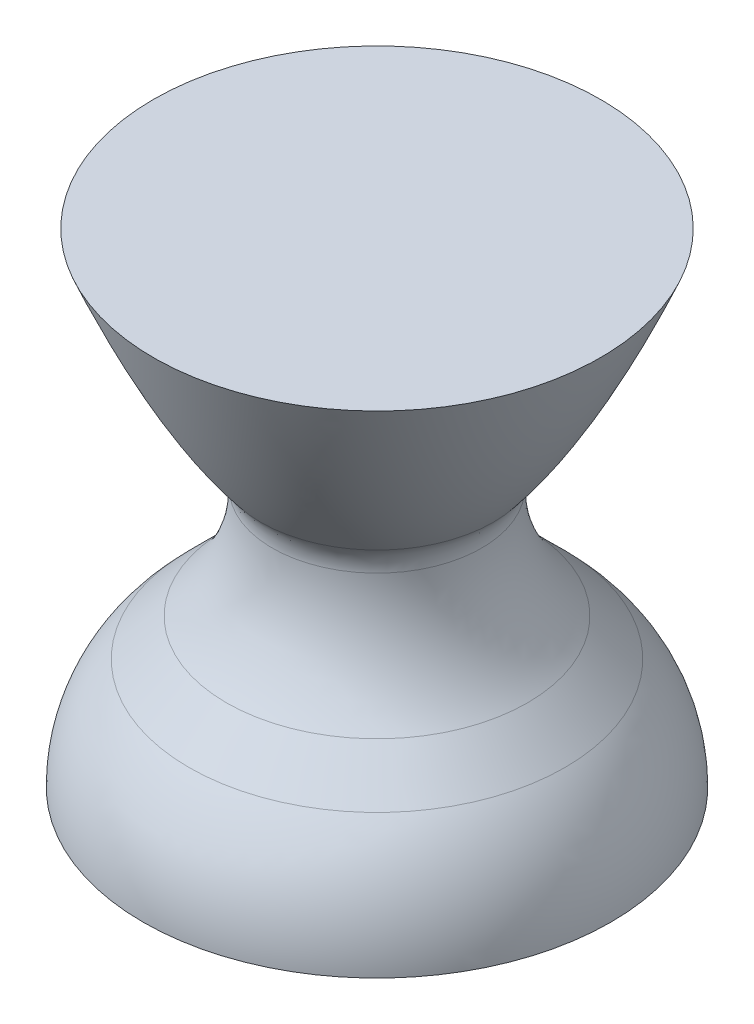
ISO-10303-21;
HEADER;
FILE_DESCRIPTION(('STEP AP214'),'2;1');
FILE_NAME('part.step','',(''),(''),'','','');
FILE_SCHEMA(('AUTOMOTIVE_DESIGN { 1 0 10303 214 1 1 1 1 }'));
ENDSEC;
DATA;
#1=APPLICATION_CONTEXT('core data for automotive mechanical design processes');
#2=APPLICATION_PROTOCOL_DEFINITION('international standard','automotive_design',2000,#1);
#3=PRODUCT_CONTEXT('',#1,'mechanical');
#4=PRODUCT('Part','Part','',(#3));
#5=PRODUCT_RELATED_PRODUCT_CATEGORY('part','',(#4));
#6=PRODUCT_DEFINITION_FORMATION('','',#4);
#7=PRODUCT_DEFINITION_CONTEXT('part definition',#1,'design');
#8=PRODUCT_DEFINITION('design','',#6,#7);
#9=PRODUCT_DEFINITION_SHAPE('','',#8);
#10=(LENGTH_UNIT() NAMED_UNIT(*) SI_UNIT(.MILLI.,.METRE.));
#11=(NAMED_UNIT(*) PLANE_ANGLE_UNIT() SI_UNIT($,.RADIAN.));
#12=(NAMED_UNIT(*) SI_UNIT($,.STERADIAN.) SOLID_ANGLE_UNIT());
#13=UNCERTAINTY_MEASURE_WITH_UNIT(LENGTH_MEASURE(1.E-05),#10,'distance_accuracy_value','');
#14=(GEOMETRIC_REPRESENTATION_CONTEXT(3) GLOBAL_UNCERTAINTY_ASSIGNED_CONTEXT((#13)) GLOBAL_UNIT_ASSIGNED_CONTEXT((#10,
#11,#12)) REPRESENTATION_CONTEXT('',''));
#15=CARTESIAN_POINT('',(0.,0.,0.));
#16=DIRECTION('',(0.,0.,1.));
#17=DIRECTION('',(1.,0.,0.));
#18=AXIS2_PLACEMENT_3D('',#15,#16,#17);
#19=CARTESIAN_POINT('',(24.0991884712947,0.000275515382464213,0.));
#20=CARTESIAN_POINT('',(24.0991890977388,0.0361681675618741,0.));
#21=CARTESIAN_POINT('',(24.0997269286903,0.110389204905756,0.));
#22=CARTESIAN_POINT('',(24.1021443200164,0.267916584778156,0.));
#23=CARTESIAN_POINT('',(24.1085821651237,0.427339632492085,0.));
#24=CARTESIAN_POINT('',(24.1206541960184,0.647039781668012,0.));
#25=CARTESIAN_POINT('',(24.1415556843351,0.901708843238853,0.));
#26=CARTESIAN_POINT('',(24.1753053160884,1.2028127882671,0.));
#27=CARTESIAN_POINT('',(24.2266199026096,1.5423260132071,0.));
#28=CARTESIAN_POINT('',(24.2906642986896,1.8812722923424,0.));
#29=CARTESIAN_POINT('',(24.3672621985688,2.21662993537458,0.));
#30=CARTESIAN_POINT('',(24.4564441685258,2.54951493609417,0.));
#31=CARTESIAN_POINT('',(24.5578620103598,2.87836816012632,0.));
#32=CARTESIAN_POINT('',(24.6717396678001,3.20362255639874,0.));
#33=CARTESIAN_POINT('',(24.7973173684178,3.5239026725951,0.));
#34=CARTESIAN_POINT('',(24.9354065740553,3.83994224812192,0.));
#35=CARTESIAN_POINT('',(25.0841908977971,4.14955769973447,0.));
#36=CARTESIAN_POINT('',(25.2461328197384,4.45505863815677,0.));
#37=CARTESIAN_POINT('',(25.4166091018143,4.7515770908833,0.));
#38=CARTESIAN_POINT('',(25.6026353182425,5.0459793766244,0.));
#39=CARTESIAN_POINT('',(25.7919088672334,5.32579445133462,0.));
#40=CARTESIAN_POINT('',(26.0045260716347,5.61100305816713,0.));
#41=CARTESIAN_POINT('',(26.1789969714405,5.8331891626991,0.));
#42=CARTESIAN_POINT('',(26.3664663530526,6.05022715196831,0.));
#43=CARTESIAN_POINT('',(26.5046758451228,6.20891716152193,0.));
#44=CARTESIAN_POINT('',(26.6705626674464,6.38239729443358,0.));
#45=CARTESIAN_POINT('',(26.7446408580787,6.45875435666021,0.));
#46=CARTESIAN_POINT('',(26.795399800002,6.50951516575317,0.));
#47=B_SPLINE_CURVE_WITH_KNOTS('',4,(#19,#20,#21,#22,#23,#24,#25,#26,#27,#28,#29,#30,#31,#32,#33,
#34,#35,#36,#37,#38,#39,#40,#41,#42,#43,#44,#45,#46),.UNSPECIFIED.,.F.,.F.,(5,1,1,1,1,1,1,1,1,1,
1,1,1,1,1,1,1,1,1,1,1,1,1,1,5),(0.0825688161645696,0.102426634352839,0.122284452541109,
0.14214227072938,0.16200008891765,0.201715725294183,0.241431361670735,0.281146998047275,
0.320862634423797,0.360578270800353,0.400293907176888,0.440009543553394,0.479725179929955,
0.519440816306493,0.559156452683,0.598872089059578,0.638587725436122,0.678303361812625,
0.718018998189203,0.75773463456574,0.797450270942234,0.837165907318803,0.857023725507066,
0.876881543695329,0.916597180071815),.UNSPECIFIED.);
#48=CARTESIAN_POINT('',(0.,61.1624662612816,0.));
#49=DIRECTION('',(0.,1.,0.));
#50=AXIS1_PLACEMENT('',#48,#49);
#51=SURFACE_OF_REVOLUTION('',#47,#50);
#52=CARTESIAN_POINT('',(0.,6.50951516575117,0.));
#53=DIRECTION('',(0.,1.,0.));
#54=DIRECTION('',(-1.,0.,0.));
#55=AXIS2_PLACEMENT_3D('',#52,#53,#54);
#56=CIRCLE('',#55,26.7953998);
#57=CARTESIAN_POINT('',(-26.7953998,6.50951516575117,0.));
#58=VERTEX_POINT('',#57);
#59=EDGE_CURVE('E10',#58,#58,#56,.T.);
#60=ORIENTED_EDGE('',*,*,#59,.F.);
#61=EDGE_LOOP('',(#60));
#62=FACE_BOUND('',#61,.T.);
#63=CARTESIAN_POINT('',(0.,0.000275514582190328,0.));
#64=DIRECTION('',(0.,1.,0.));
#65=DIRECTION('',(-1.,0.,0.));
#66=AXIS2_PLACEMENT_3D('',#63,#64,#65);
#67=CIRCLE('',#66,24.0991884712948);
#68=CARTESIAN_POINT('',(-24.0991884712948,0.000275514582187187,0.));
#69=VERTEX_POINT('',#68);
#70=EDGE_CURVE('E54',#69,#69,#67,.T.);
#71=ORIENTED_EDGE('',*,*,#70,.T.);
#72=EDGE_LOOP('',(#71));
#73=FACE_BOUND('',#72,.T.);
#74=ADVANCED_FACE('F31',(#62,#73),#51,.T.);
#75=CARTESIAN_POINT('',(26.7953998,6.50951516575118,0.));
#76=CARTESIAN_POINT('',(39.1526649,21.9803322747265,0.));
#77=CARTESIAN_POINT('',(51.50993,51.7205381411871,0.));
#78=B_SPLINE_CURVE_WITH_KNOTS('',2,(#75,#76,#77),.UNSPECIFIED.,.F.,.F.,(3,3),(0.,1.),.UNSPECIFIED.);
#79=CARTESIAN_POINT('',(0.,61.1624662612816,0.));
#80=DIRECTION('',(0.,1.,0.));
#81=AXIS1_PLACEMENT('',#79,#80);
#82=SURFACE_OF_REVOLUTION('',#78,#81);
#83=CARTESIAN_POINT('',(0.,51.7205381411871,0.));
#84=DIRECTION('',(0.,1.,0.));
#85=DIRECTION('',(-1.,0.,0.));
#86=AXIS2_PLACEMENT_3D('',#83,#84,#85);
#87=CIRCLE('',#86,51.50993);
#88=CARTESIAN_POINT('',(-51.50993,51.7205381411871,0.));
#89=VERTEX_POINT('',#88);
#90=EDGE_CURVE('E38',#89,#89,#87,.T.);
#91=ORIENTED_EDGE('',*,*,#90,.F.);
#92=EDGE_LOOP('',(#91));
#93=FACE_BOUND('',#92,.T.);
#94=ORIENTED_EDGE('',*,*,#59,.T.);
#95=EDGE_LOOP('',(#94));
#96=FACE_BOUND('',#95,.T.);
#97=ADVANCED_FACE('F87',(#93,#96),#82,.T.);
#98=CARTESIAN_POINT('',(51.50993,51.7205381411871,0.));
#99=DIRECTION('',(0.,-1.,0.));
#100=DIRECTION('',(1.,0.,0.));
#101=AXIS2_PLACEMENT_3D('',#98,#99,#100);
#102=PLANE('',#101);
#103=ORIENTED_EDGE('',*,*,#90,.T.);
#104=EDGE_LOOP('',(#103));
#105=FACE_BOUND('',#104,.T.);
#106=ADVANCED_FACE('F84',(#105),#102,.F.);
#107=CARTESIAN_POINT('',(53.8816482385799,-59.7273983820062,0.));
#108=DIRECTION('',(0.,1.,0.));
#109=DIRECTION('',(-1.,0.,0.));
#110=AXIS2_PLACEMENT_3D('',#107,#108,#109);
#111=PLANE('',#110);
#112=CARTESIAN_POINT('',(0.,-59.7273983820062,0.));
#113=DIRECTION('',(0.,1.,0.));
#114=DIRECTION('',(-1.,0.,0.));
#115=AXIS2_PLACEMENT_3D('',#112,#113,#114);
#116=CIRCLE('',#115,53.8816482385798);
#117=CARTESIAN_POINT('',(-53.8816482385798,-59.7273983820062,0.));
#118=VERTEX_POINT('',#117);
#119=EDGE_CURVE('E42',#118,#118,#116,.T.);
#120=ORIENTED_EDGE('',*,*,#119,.F.);
#121=EDGE_LOOP('',(#120));
#122=FACE_BOUND('',#121,.T.);
#123=ADVANCED_FACE('F80',(#122),#111,.F.);
#124=CARTESIAN_POINT('',(53.8816482385798,-59.7273983807063,0.));
#125=CARTESIAN_POINT('',(53.8816470075851,-59.6568683275287,0.));
#126=CARTESIAN_POINT('',(53.8811178653264,-59.5152912738705,0.));
#127=CARTESIAN_POINT('',(53.8787420167183,-59.1814497873879,0.));
#128=CARTESIAN_POINT('',(53.872417419243,-58.9046806635794,0.));
#129=CARTESIAN_POINT('',(53.8629319340301,-58.5324526585413,0.));
#130=CARTESIAN_POINT('',(53.8502890380709,-58.2127227925457,0.));
#131=CARTESIAN_POINT('',(53.8305382124441,-57.7814796133651,0.));
#132=CARTESIAN_POINT('',(53.8005258739891,-57.2808450696993,0.));
#133=CARTESIAN_POINT('',(53.7563137137351,-56.6878833355134,0.));
#134=CARTESIAN_POINT('',(53.6774090482294,-55.8483655357584,0.));
#135=CARTESIAN_POINT('',(53.5775474620813,-55.008051029838,0.));
#136=CARTESIAN_POINT('',(53.4567963912008,-54.172320599092,0.));
#137=CARTESIAN_POINT('',(53.2869314320759,-53.1723104078013,0.));
#138=CARTESIAN_POINT('',(53.092184801757,-52.1773279883641,0.));
#139=CARTESIAN_POINT('',(52.8664957400676,-51.1884242493038,0.));
#140=CARTESIAN_POINT('',(52.6101348490193,-50.2073742028283,0.));
#141=CARTESIAN_POINT('',(52.3294099698692,-49.2329629034284,0.));
#142=CARTESIAN_POINT('',(52.0244693736317,-48.2658543853352,0.));
#143=CARTESIAN_POINT('',(51.6336584709592,-47.149020226829,0.));
#144=CARTESIAN_POINT('',(51.1396410072391,-45.8902935626458,0.));
#145=CARTESIAN_POINT('',(50.598854405088,-44.650853958123,0.));
#146=CARTESIAN_POINT('',(50.0121815863551,-43.4325866774938,0.));
#147=CARTESIAN_POINT('',(49.3802408951547,-42.2369783874,0.));
#148=CARTESIAN_POINT('',(48.7042458992822,-41.0660400239986,0.));
#149=CARTESIAN_POINT('',(47.9845961958365,-39.9208577985993,0.));
#150=CARTESIAN_POINT('',(47.2232228198061,-38.8039613767444,0.));
#151=CARTESIAN_POINT('',(46.5199897469294,-37.8513369191951,0.));
#152=CARTESIAN_POINT('',(45.8936586278378,-37.0555572534908,0.));
#153=CARTESIAN_POINT('',(45.3529383743681,-36.4032664103704,0.));
#154=CARTESIAN_POINT('',(44.9152476445637,-35.8941327587056,0.));
#155=CARTESIAN_POINT('',(44.5148968883842,-35.44687778127,0.));
#156=CARTESIAN_POINT('',(44.1815782033444,-35.0845163075683,0.));
#157=CARTESIAN_POINT('',(43.8740453263198,-34.760225272034,0.));
#158=CARTESIAN_POINT('',(43.6741931096344,-34.551434570712,0.));
#159=CARTESIAN_POINT('',(43.4445127769869,-34.3184014063881,0.));
#160=CARTESIAN_POINT('',(43.3439038560671,-34.2170471734038,0.));
#161=CARTESIAN_POINT('',(43.2940316972989,-34.1671747743983,0.));
#162=B_SPLINE_CURVE_WITH_KNOTS('',4,(#124,#125,#126,#127,#128,#129,#130,#131,#132,#133,#134,
#135,#136,#137,#138,#139,#140,#141,#142,#143,#144,#145,#146,#147,#148,#149,#150,#151,#152,#153,
#154,#155,#156,#157,#158,#159,#160,#161),.UNSPECIFIED.,.F.,.F.,(5,1,1,1,1,1,1,1,1,1,1,1,1,1,1,1,
1,1,1,1,1,1,1,1,1,1,1,1,1,1,1,1,1,1,5),(0.0826377294687148,0.0925749264345476,0.102512123350778,
0.112449320267009,0.122386517183239,0.132323714099469,0.1422609110157,0.162135304848161,
0.182009698680622,0.201884092513083,0.241632880178004,0.261507274010465,0.281381667842925,
0.321130455507847,0.360879243172768,0.380753637005229,0.40062803083769,0.440376818502612,
0.480125606167533,0.519874393832454,0.559623181497376,0.599371969162297,0.639120756827219,
0.67886954449214,0.718618332157062,0.758367119821984,0.798115907486905,0.817990301319366,
0.837864695151827,0.857739088984288,0.877613482816748,0.887550679732981,0.897487876649213,
0.907425073565445,0.917362270436565),.UNSPECIFIED.);
#163=CARTESIAN_POINT('',(0.,61.1624662612816,0.));
#164=DIRECTION('',(0.,1.,0.));
#165=AXIS1_PLACEMENT('',#163,#164);
#166=SURFACE_OF_REVOLUTION('',#162,#165);
#167=CARTESIAN_POINT('',(0.,-34.1671747743984,0.));
#168=DIRECTION('',(0.,1.,0.));
#169=DIRECTION('',(-1.,0.,0.));
#170=AXIS2_PLACEMENT_3D('',#167,#168,#169);
#171=CIRCLE('',#170,43.2940316972989);
#172=CARTESIAN_POINT('',(-43.2940316972989,-34.1671747743984,0.));
#173=VERTEX_POINT('',#172);
#174=EDGE_CURVE('E46',#173,#173,#171,.T.);
#175=ORIENTED_EDGE('',*,*,#174,.F.);
#176=EDGE_LOOP('',(#175));
#177=FACE_BOUND('',#176,.T.);
#178=ORIENTED_EDGE('',*,*,#119,.T.);
#179=EDGE_LOOP('',(#178));
#180=FACE_BOUND('',#179,.T.);
#181=ADVANCED_FACE('F76',(#177,#180),#166,.T.);
#182=CARTESIAN_POINT('',(0.,-34.1671747743984,0.));
#183=DIRECTION('',(0.,-1.,0.));
#184=DIRECTION('',(1.,0.,0.));
#185=AXIS2_PLACEMENT_3D('',#182,#183,#184);
#186=CONICAL_SURFACE('',#185,43.2940316972989,0.785398163423349);
#187=CARTESIAN_POINT('',(0.,-25.5595465793544,0.));
#188=DIRECTION('',(0.,1.,0.));
#189=DIRECTION('',(-1.,0.,0.));
#190=AXIS2_PLACEMENT_3D('',#187,#188,#189);
#191=CIRCLE('',#190,34.6864035018091);
#192=CARTESIAN_POINT('',(-34.6864035018091,-25.5595465793545,0.));
#193=VERTEX_POINT('',#192);
#194=EDGE_CURVE('E51',#193,#193,#191,.T.);
#195=ORIENTED_EDGE('',*,*,#194,.F.);
#196=EDGE_LOOP('',(#195));
#197=FACE_BOUND('',#196,.T.);
#198=ORIENTED_EDGE('',*,*,#174,.T.);
#199=EDGE_LOOP('',(#198));
#200=FACE_BOUND('',#199,.T.);
#201=ADVANCED_FACE('F72',(#197,#200),#186,.T.);
#202=CARTESIAN_POINT('',(34.6864035021105,-25.5595465800819,0.));
#203=CARTESIAN_POINT('',(34.6365331242032,-25.5096743951715,0.));
#204=CARTESIAN_POINT('',(34.5369806558507,-25.4093735100554,0.));
#205=CARTESIAN_POINT('',(34.2456793368716,-25.113592773919,0.));
#206=CARTESIAN_POINT('',(33.9359468171503,-24.7882088540116,0.));
#207=CARTESIAN_POINT('',(33.5085707201383,-24.3295407111677,0.));
#208=CARTESIAN_POINT('',(33.0723764601426,-23.8397294821636,0.));
#209=CARTESIAN_POINT('',(32.6242491063985,-23.3201466046367,0.));
#210=CARTESIAN_POINT('',(32.088856810417,-22.6731699477703,0.));
#211=CARTESIAN_POINT('',(31.4592878768492,-21.8741362286249,0.));
#212=CARTESIAN_POINT('',(30.7581426798475,-20.9235845442963,0.));
#213=CARTESIAN_POINT('',(29.9955657778196,-19.8054678673087,0.));
#214=CARTESIAN_POINT('',(29.2766530672449,-18.6610122290651,0.));
#215=CARTESIAN_POINT('',(28.6002600643343,-17.4896632671045,0.));
#216=CARTESIAN_POINT('',(27.9686000484929,-16.2943342680478,0.));
#217=CARTESIAN_POINT('',(27.3817937789051,-15.0759216040517,0.));
#218=CARTESIAN_POINT('',(26.8411239748233,-13.8366119601687,0.));
#219=CARTESIAN_POINT('',(26.3470660388392,-12.5778238119466,0.));
#220=CARTESIAN_POINT('',(25.9004816254319,-11.3015440744438,0.));
#221=CARTESIAN_POINT('',(25.5018912601901,-10.0093616870533,0.));
#222=CARTESIAN_POINT('',(25.1519159449444,-8.70329899352493,0.));
#223=CARTESIAN_POINT('',(24.8510058593227,-7.38489089430947,0.));
#224=CARTESIAN_POINT('',(24.599606664976,-6.05643524025137,0.));
#225=CARTESIAN_POINT('',(24.423247294492,-4.88617486834959,0.));
#226=CARTESIAN_POINT('',(24.3034203196059,-3.87970315525967,0.));
#227=CARTESIAN_POINT('',(24.2324076566295,-3.1217584272546,0.));
#228=CARTESIAN_POINT('',(24.192939448147,-2.61779388042041,0.));
#229=CARTESIAN_POINT('',(24.165301832525,-2.19343135233525,0.));
#230=CARTESIAN_POINT('',(24.1463465728624,-1.86166408383597,0.));
#231=CARTESIAN_POINT('',(24.13054634774,-1.51315953895323,0.));
#232=CARTESIAN_POINT('',(24.1179040538095,-1.19454655238165,0.));
#233=CARTESIAN_POINT('',(24.1084189314292,-0.823884877492712,0.));
#234=CARTESIAN_POINT('',(24.1020945362602,-0.542907396776771,0.));
#235=CARTESIAN_POINT('',(24.0997188499176,-0.213308670587181,0.));
#236=CARTESIAN_POINT('',(24.0991897022511,-0.0702531279599257,0.));
#237=CARTESIAN_POINT('',(24.0991884712948,0.000275514582189854,0.));
#238=B_SPLINE_CURVE_WITH_KNOTS('',4,(#202,#203,#204,#205,#206,#207,#208,#209,#210,#211,#212,
#213,#214,#215,#216,#217,#218,#219,#220,#221,#222,#223,#224,#225,#226,#227,#228,#229,#230,#231,
#232,#233,#234,#235,#236,#237),.UNSPECIFIED.,.F.,.F.,(5,1,1,1,1,1,1,1,1,1,1,1,1,1,1,1,1,1,1,1,1,
1,1,1,1,1,1,1,1,1,1,1,5),(0.0826377294891245,0.0925749263767643,0.102512123292996,
0.12238651712546,0.142260910957922,0.162135304790384,0.182009698622845,0.201884092455306,
0.24163288012023,0.281381667785154,0.321130455450077,0.360879243114999,0.400628030779919,
0.44037681844484,0.480125606109761,0.519874393774682,0.559623181439603,0.599371969104524,
0.639120756769445,0.678869544434366,0.718618332099286,0.758367119764207,0.798115907429128,
0.817990301261589,0.83786469509405,0.847801892010281,0.857739088926511,0.867676285842742,
0.877613482758972,0.887550679675203,0.897487876591433,0.907425073507664,0.917362270453089),.UNSPECIFIED.);
#239=CARTESIAN_POINT('',(0.,61.1624662612816,0.));
#240=DIRECTION('',(0.,1.,0.));
#241=AXIS1_PLACEMENT('',#239,#240);
#242=SURFACE_OF_REVOLUTION('',#238,#241);
#243=ORIENTED_EDGE('',*,*,#70,.F.);
#244=EDGE_LOOP('',(#243));
#245=FACE_BOUND('',#244,.T.);
#246=ORIENTED_EDGE('',*,*,#194,.T.);
#247=EDGE_LOOP('',(#246));
#248=FACE_BOUND('',#247,.T.);
#249=ADVANCED_FACE('F69',(#245,#248),#242,.T.);
#250=CLOSED_SHELL('',(#74,#97,#106,#123,#181,#201,#249));
#251=MANIFOLD_SOLID_BREP('B2',#250);
#252=ADVANCED_BREP_SHAPE_REPRESENTATION('',(#18,#251),#14);
#253=SHAPE_DEFINITION_REPRESENTATION(#9,#252);
ENDSEC;
END-ISO-10303-21;
